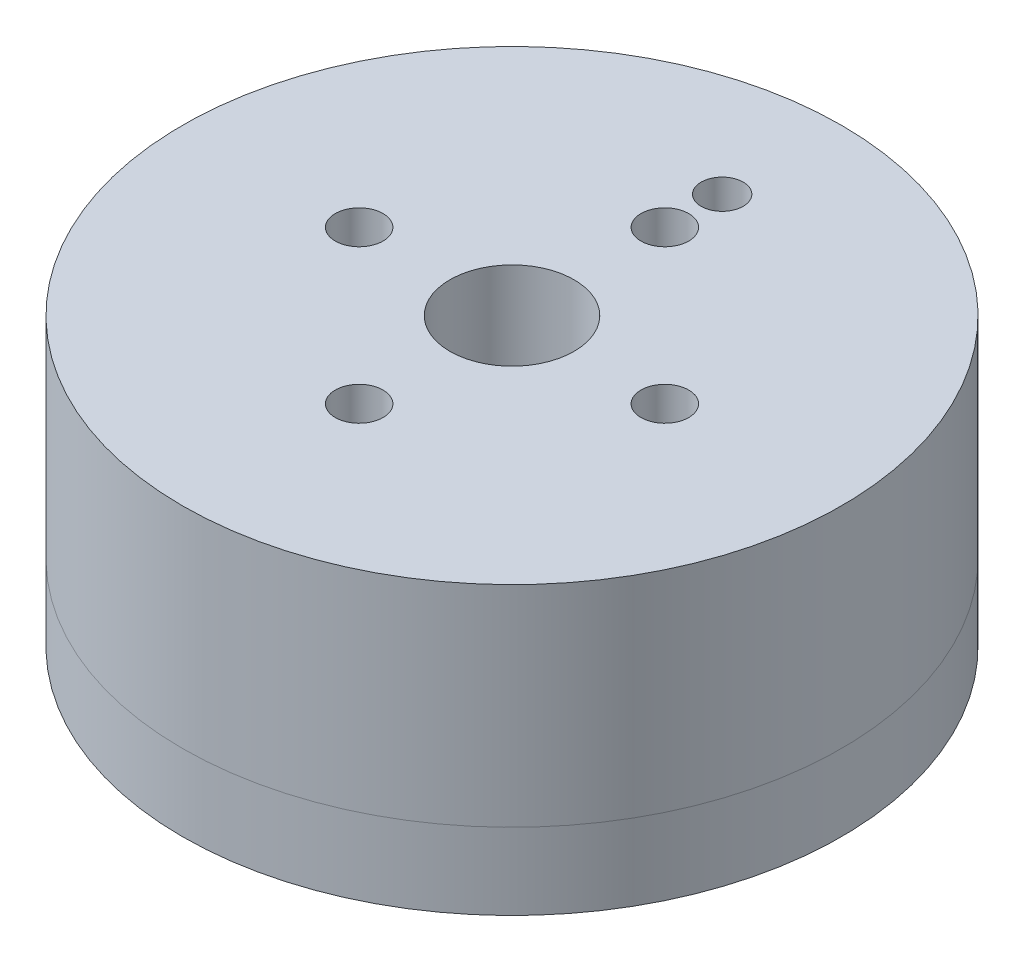
ISO-10303-21;
HEADER;
FILE_DESCRIPTION(('STEP AP214'),'2;1');
FILE_NAME('part.step','',(''),(''),'','','');
FILE_SCHEMA(('AUTOMOTIVE_DESIGN { 1 0 10303 214 1 1 1 1 }'));
ENDSEC;
DATA;
#1=APPLICATION_CONTEXT('core data for automotive mechanical design processes');
#2=APPLICATION_PROTOCOL_DEFINITION('international standard','automotive_design',2000,#1);
#3=PRODUCT_CONTEXT('',#1,'mechanical');
#4=PRODUCT('Part','Part','',(#3));
#5=PRODUCT_RELATED_PRODUCT_CATEGORY('part','',(#4));
#6=PRODUCT_DEFINITION_FORMATION('','',#4);
#7=PRODUCT_DEFINITION_CONTEXT('part definition',#1,'design');
#8=PRODUCT_DEFINITION('design','',#6,#7);
#9=PRODUCT_DEFINITION_SHAPE('','',#8);
#10=(LENGTH_UNIT() NAMED_UNIT(*) SI_UNIT(.MILLI.,.METRE.));
#11=(NAMED_UNIT(*) PLANE_ANGLE_UNIT() SI_UNIT($,.RADIAN.));
#12=(NAMED_UNIT(*) SI_UNIT($,.STERADIAN.) SOLID_ANGLE_UNIT());
#13=UNCERTAINTY_MEASURE_WITH_UNIT(LENGTH_MEASURE(1.E-05),#10,'distance_accuracy_value','');
#14=(GEOMETRIC_REPRESENTATION_CONTEXT(3) GLOBAL_UNCERTAINTY_ASSIGNED_CONTEXT((#13)) GLOBAL_UNIT_ASSIGNED_CONTEXT((#10,
#11,#12)) REPRESENTATION_CONTEXT('',''));
#15=CARTESIAN_POINT('',(0.,0.,0.));
#16=DIRECTION('',(0.,0.,1.));
#17=DIRECTION('',(1.,0.,0.));
#18=AXIS2_PLACEMENT_3D('',#15,#16,#17);
#19=CARTESIAN_POINT('',(0.,-8.5,0.));
#20=DIRECTION('',(0.,1.,0.));
#21=DIRECTION('',(0.,0.,1.));
#22=AXIS2_PLACEMENT_3D('',#19,#20,#21);
#23=CYLINDRICAL_SURFACE('',#22,5.);
#24=CARTESIAN_POINT('',(0.,-4.26794919243103,-5.));
#25=CARTESIAN_POINT('',(0.654498465135642,-4.26794919243103,-5.));
#26=CARTESIAN_POINT('',(1.30873942582763,-4.26794919243103,-4.86986338167179));
#27=CARTESIAN_POINT('',(2.51809489782327,-4.26794919243103,-4.36893194344108));
#28=CARTESIAN_POINT('',(3.07273360295979,-4.26794919243103,-3.99833420890569));
#29=CARTESIAN_POINT('',(3.99833420890569,-4.26794919243103,-3.07273360295979));
#30=CARTESIAN_POINT('',(4.36893194344106,-4.26794919243103,-2.5180948978233));
#31=CARTESIAN_POINT('',(4.8698633816718,-4.26794919243103,-1.30873942582759));
#32=CARTESIAN_POINT('',(5.,-4.26794919243103,-0.654498465134551));
#33=CARTESIAN_POINT('',(5.,-4.26794919243103,0.65449846513455));
#34=CARTESIAN_POINT('',(4.86986338167174,-4.26794919243103,1.30873942582773));
#35=CARTESIAN_POINT('',(4.36893194344112,-4.26794919243103,2.51809489782317));
#36=CARTESIAN_POINT('',(3.99833420890554,-4.26794919243102,3.07273360295993));
#37=CARTESIAN_POINT('',(3.07273360295993,-4.26794919243102,3.99833420890555));
#38=CARTESIAN_POINT('',(2.51809489782321,-4.26794919243103,4.3689319434411));
#39=CARTESIAN_POINT('',(1.3087394258277,-4.26794919243103,4.86986338167176));
#40=CARTESIAN_POINT('',(0.654498465134551,-4.26794919243103,5.));
#41=CARTESIAN_POINT('',(-0.65449846513455,-4.26794919243103,5.));
#42=CARTESIAN_POINT('',(-1.30873942582759,-4.26794919243103,4.86986338167181));
#43=CARTESIAN_POINT('',(-2.5180948978233,-4.26794919243103,4.36893194344107));
#44=CARTESIAN_POINT('',(-3.07273360295993,-4.26794919243102,3.99833420890554));
#45=CARTESIAN_POINT('',(-3.99833420890555,-4.26794919243102,3.07273360295993));
#46=CARTESIAN_POINT('',(-4.36893194344107,-4.26794919243103,2.51809489782328));
#47=CARTESIAN_POINT('',(-4.86986338167179,-4.26794919243103,1.30873942582763));
#48=CARTESIAN_POINT('',(-5.,-4.26794919243103,0.654498465134543));
#49=CARTESIAN_POINT('',(-5.,-4.26794919243103,-0.654498465134559));
#50=CARTESIAN_POINT('',(-4.86986338167173,-4.26794919243103,-1.30873942582776));
#51=CARTESIAN_POINT('',(-4.36893194344114,-4.26794919243103,-2.51809489782312));
#52=CARTESIAN_POINT('',(-3.99833420890559,-4.26794919243102,-3.07273360295988));
#53=CARTESIAN_POINT('',(-3.07273360295991,-4.26794919243102,-3.99833420890557));
#54=CARTESIAN_POINT('',(-2.51809489782318,-4.26794919243103,-4.36893194344111));
#55=CARTESIAN_POINT('',(-1.30873942582773,-4.26794919243103,-4.86986338167175));
#56=CARTESIAN_POINT('',(-0.654498465135643,-4.26794919243103,-5.));
#57=CARTESIAN_POINT('',(0.,-4.26794919243103,-5.));
#58=(BOUNDED_CURVE() B_SPLINE_CURVE(3,(#24,#25,#26,#27,#28,#29,#30,#31,#32,#33,#34,#35,#36,#37,
#38,#39,#40,#41,#42,#43,#44,#45,#46,#47,#48,#49,#50,#51,#52,#53,#54,#55,#56,#57),.UNSPECIFIED.,
.T.,.F.) B_SPLINE_CURVE_WITH_KNOTS((4,2,2,2,2,2,2,2,2,2,2,2,2,2,2,2,4),(0.,0.392699081698724,
0.785398163397448,1.17809724509617,1.5707963267949,1.96349540849362,2.35619449019234,
2.74889357189107,3.14159265358979,3.53429173528852,3.92699081698724,4.31968989868597,
4.71238898038469,5.10508806208341,5.49778714378214,5.89048622548086,6.28318530717959),
.UNSPECIFIED.) CURVE() GEOMETRIC_REPRESENTATION_ITEM() RATIONAL_B_SPLINE_CURVE((1.,1.,1.,1.,1.,
1.,1.,1.,1.,1.,1.,1.,1.,1.,1.,1.,1.,1.,1.,1.,1.,1.,1.,1.,1.,1.,1.,1.,1.,1.,1.,1.,1.,1.)) REPRESENTATION_ITEM(''));
#59=CARTESIAN_POINT('',(0.,-4.26794919243103,-5.));
#60=VERTEX_POINT('',#59);
#61=EDGE_CURVE('E13',#60,#60,#58,.F.);
#62=ORIENTED_EDGE('',*,*,#61,.T.);
#63=EDGE_LOOP('',(#62));
#64=FACE_BOUND('',#63,.T.);
#65=CARTESIAN_POINT('',(0.,-4.,0.));
#66=DIRECTION('',(0.,1.,0.));
#67=DIRECTION('',(0.,0.,1.));
#68=AXIS2_PLACEMENT_3D('',#65,#66,#67);
#69=CIRCLE('',#68,5.);
#70=CARTESIAN_POINT('',(0.,-4.,5.));
#71=VERTEX_POINT('',#70);
#72=EDGE_CURVE('E74',#71,#71,#69,.F.);
#73=ORIENTED_EDGE('',*,*,#72,.T.);
#74=EDGE_LOOP('',(#73));
#75=FACE_BOUND('',#74,.T.);
#76=ADVANCED_FACE('F60',(#64,#75),#23,.T.);
#77=CARTESIAN_POINT('',(0.,-4.,0.));
#78=DIRECTION('',(0.,1.,0.));
#79=DIRECTION('',(0.,0.,1.));
#80=AXIS2_PLACEMENT_3D('',#77,#78,#79);
#81=CYLINDRICAL_SURFACE('',#80,17.25);
#82=CARTESIAN_POINT('',(0.,-4.,0.));
#83=DIRECTION('',(0.,1.,0.));
#84=DIRECTION('',(0.,0.,1.));
#85=AXIS2_PLACEMENT_3D('',#82,#83,#84);
#86=CIRCLE('',#85,17.25);
#87=CARTESIAN_POINT('',(0.,-4.,17.25));
#88=VERTEX_POINT('',#87);
#89=EDGE_CURVE('E79',#88,#88,#86,.T.);
#90=ORIENTED_EDGE('',*,*,#89,.T.);
#91=EDGE_LOOP('',(#90));
#92=FACE_BOUND('',#91,.T.);
#93=CARTESIAN_POINT('',(0.,0.,0.));
#94=DIRECTION('',(0.,1.,0.));
#95=DIRECTION('',(0.,0.,1.));
#96=AXIS2_PLACEMENT_3D('',#93,#94,#95);
#97=CIRCLE('',#96,17.25);
#98=CARTESIAN_POINT('',(0.,0.,17.25));
#99=VERTEX_POINT('',#98);
#100=EDGE_CURVE('E84',#99,#99,#97,.T.);
#101=ORIENTED_EDGE('',*,*,#100,.F.);
#102=EDGE_LOOP('',(#101));
#103=FACE_BOUND('',#102,.T.);
#104=ADVANCED_FACE('F108',(#92,#103),#81,.T.);
#105=CARTESIAN_POINT('',(0.,-4.,0.));
#106=DIRECTION('',(0.,1.,0.));
#107=DIRECTION('',(0.,0.,1.));
#108=AXIS2_PLACEMENT_3D('',#105,#106,#107);
#109=PLANE('',#108);
#110=ORIENTED_EDGE('',*,*,#72,.F.);
#111=EDGE_LOOP('',(#110));
#112=FACE_BOUND('',#111,.T.);
#113=CARTESIAN_POINT('',(-6.69999999999986,-4.,-6.7));
#114=DIRECTION('',(0.,-1.,0.));
#115=DIRECTION('',(0.,0.,-1.));
#116=AXIS2_PLACEMENT_3D('',#113,#114,#115);
#117=CIRCLE('',#116,1.25);
#118=CARTESIAN_POINT('',(-6.69999999999986,-4.,-7.95));
#119=VERTEX_POINT('',#118);
#120=EDGE_CURVE('E160',#119,#119,#117,.T.);
#121=ORIENTED_EDGE('',*,*,#120,.F.);
#122=EDGE_LOOP('',(#121));
#123=FACE_BOUND('',#122,.T.);
#124=CARTESIAN_POINT('',(6.70000000000014,-4.,-6.7));
#125=DIRECTION('',(0.,-1.,0.));
#126=DIRECTION('',(0.,0.,-1.));
#127=AXIS2_PLACEMENT_3D('',#124,#125,#126);
#128=CIRCLE('',#127,1.25);
#129=CARTESIAN_POINT('',(6.70000000000014,-4.,-7.95));
#130=VERTEX_POINT('',#129);
#131=EDGE_CURVE('E167',#130,#130,#128,.T.);
#132=ORIENTED_EDGE('',*,*,#131,.F.);
#133=EDGE_LOOP('',(#132));
#134=FACE_BOUND('',#133,.T.);
#135=CARTESIAN_POINT('',(6.7,-4.,6.7));
#136=DIRECTION('',(0.,-1.,0.));
#137=DIRECTION('',(0.,0.,-1.));
#138=AXIS2_PLACEMENT_3D('',#135,#136,#137);
#139=CIRCLE('',#138,1.25);
#140=CARTESIAN_POINT('',(6.7,-4.,5.45));
#141=VERTEX_POINT('',#140);
#142=EDGE_CURVE('E173',#141,#141,#139,.T.);
#143=ORIENTED_EDGE('',*,*,#142,.F.);
#144=EDGE_LOOP('',(#143));
#145=FACE_BOUND('',#144,.T.);
#146=CARTESIAN_POINT('',(13.1673915721447,-4.,0.));
#147=DIRECTION('',(0.,-1.,0.));
#148=DIRECTION('',(0.,0.,-1.));
#149=AXIS2_PLACEMENT_3D('',#146,#147,#148);
#150=CIRCLE('',#149,1.1);
#151=CARTESIAN_POINT('',(13.1673915721447,-4.,-1.1));
#152=VERTEX_POINT('',#151);
#153=EDGE_CURVE('E154',#152,#152,#150,.T.);
#154=ORIENTED_EDGE('',*,*,#153,.F.);
#155=EDGE_LOOP('',(#154));
#156=FACE_BOUND('',#155,.T.);
#157=CARTESIAN_POINT('',(-6.7,-4.,6.7));
#158=DIRECTION('',(0.,-1.,0.));
#159=DIRECTION('',(0.,0.,-1.));
#160=AXIS2_PLACEMENT_3D('',#157,#158,#159);
#161=CIRCLE('',#160,1.25);
#162=CARTESIAN_POINT('',(-6.7,-4.,5.45));
#163=VERTEX_POINT('',#162);
#164=EDGE_CURVE('E149',#163,#163,#161,.T.);
#165=ORIENTED_EDGE('',*,*,#164,.F.);
#166=EDGE_LOOP('',(#165));
#167=FACE_BOUND('',#166,.T.);
#168=ORIENTED_EDGE('',*,*,#89,.F.);
#169=EDGE_LOOP('',(#168));
#170=FACE_BOUND('',#169,.T.);
#171=ADVANCED_FACE('F132',(#112,#123,#134,#145,#156,#167,#170),#109,.F.);
#172=CARTESIAN_POINT('',(0.,0.,0.));
#173=DIRECTION('',(0.,1.,0.));
#174=DIRECTION('',(0.,0.,1.));
#175=AXIS2_PLACEMENT_3D('',#172,#173,#174);
#176=PLANE('',#175);
#177=CARTESIAN_POINT('',(0.,0.,0.));
#178=DIRECTION('',(0.,1.,0.));
#179=DIRECTION('',(0.,0.,1.));
#180=AXIS2_PLACEMENT_3D('',#177,#178,#179);
#181=CIRCLE('',#180,3.25);
#182=CARTESIAN_POINT('',(0.,0.,3.25));
#183=VERTEX_POINT('',#182);
#184=EDGE_CURVE('E88',#183,#183,#181,.F.);
#185=ORIENTED_EDGE('',*,*,#184,.T.);
#186=EDGE_LOOP('',(#185));
#187=FACE_BOUND('',#186,.T.);
#188=CARTESIAN_POINT('',(-6.69999999999986,0.,-6.7));
#189=DIRECTION('',(0.,-1.,0.));
#190=DIRECTION('',(0.,0.,-1.));
#191=AXIS2_PLACEMENT_3D('',#188,#189,#190);
#192=CIRCLE('',#191,1.25);
#193=CARTESIAN_POINT('',(-6.69999999999986,0.,-7.95));
#194=VERTEX_POINT('',#193);
#195=EDGE_CURVE('E157',#194,#194,#192,.T.);
#196=ORIENTED_EDGE('',*,*,#195,.T.);
#197=EDGE_LOOP('',(#196));
#198=FACE_BOUND('',#197,.T.);
#199=CARTESIAN_POINT('',(6.70000000000014,0.,-6.7));
#200=DIRECTION('',(0.,-1.,0.));
#201=DIRECTION('',(0.,0.,-1.));
#202=AXIS2_PLACEMENT_3D('',#199,#200,#201);
#203=CIRCLE('',#202,1.25);
#204=CARTESIAN_POINT('',(6.70000000000014,0.,-7.95));
#205=VERTEX_POINT('',#204);
#206=EDGE_CURVE('E164',#205,#205,#203,.T.);
#207=ORIENTED_EDGE('',*,*,#206,.T.);
#208=EDGE_LOOP('',(#207));
#209=FACE_BOUND('',#208,.T.);
#210=CARTESIAN_POINT('',(6.7,0.,6.7));
#211=DIRECTION('',(0.,-1.,0.));
#212=DIRECTION('',(0.,0.,-1.));
#213=AXIS2_PLACEMENT_3D('',#210,#211,#212);
#214=CIRCLE('',#213,1.25);
#215=CARTESIAN_POINT('',(6.7,0.,5.45));
#216=VERTEX_POINT('',#215);
#217=EDGE_CURVE('E170',#216,#216,#214,.T.);
#218=ORIENTED_EDGE('',*,*,#217,.T.);
#219=EDGE_LOOP('',(#218));
#220=FACE_BOUND('',#219,.T.);
#221=CARTESIAN_POINT('',(13.1673915721447,0.,0.));
#222=DIRECTION('',(0.,-1.,0.));
#223=DIRECTION('',(0.,0.,-1.));
#224=AXIS2_PLACEMENT_3D('',#221,#222,#223);
#225=CIRCLE('',#224,1.1);
#226=CARTESIAN_POINT('',(13.1673915721447,0.,-1.1));
#227=VERTEX_POINT('',#226);
#228=EDGE_CURVE('E176',#227,#227,#225,.T.);
#229=ORIENTED_EDGE('',*,*,#228,.T.);
#230=EDGE_LOOP('',(#229));
#231=FACE_BOUND('',#230,.T.);
#232=CARTESIAN_POINT('',(-6.7,0.,6.7));
#233=DIRECTION('',(0.,-1.,0.));
#234=DIRECTION('',(0.,0.,-1.));
#235=AXIS2_PLACEMENT_3D('',#232,#233,#234);
#236=CIRCLE('',#235,1.25);
#237=CARTESIAN_POINT('',(-6.7,0.,5.45));
#238=VERTEX_POINT('',#237);
#239=EDGE_CURVE('E147',#238,#238,#236,.T.);
#240=ORIENTED_EDGE('',*,*,#239,.T.);
#241=EDGE_LOOP('',(#240));
#242=FACE_BOUND('',#241,.T.);
#243=ORIENTED_EDGE('',*,*,#100,.T.);
#244=EDGE_LOOP('',(#243));
#245=FACE_BOUND('',#244,.T.);
#246=ADVANCED_FACE('F130',(#187,#198,#209,#220,#231,#242,#245),#176,.T.);
#247=CARTESIAN_POINT('',(-6.7,0.,6.7));
#248=DIRECTION('',(0.,-1.,0.));
#249=DIRECTION('',(0.,0.,-1.));
#250=AXIS2_PLACEMENT_3D('',#247,#248,#249);
#251=CYLINDRICAL_SURFACE('',#250,1.25);
#252=ORIENTED_EDGE('',*,*,#239,.F.);
#253=EDGE_LOOP('',(#252));
#254=FACE_BOUND('',#253,.T.);
#255=ORIENTED_EDGE('',*,*,#164,.T.);
#256=EDGE_LOOP('',(#255));
#257=FACE_BOUND('',#256,.T.);
#258=ADVANCED_FACE('F114',(#254,#257),#251,.F.);
#259=CARTESIAN_POINT('',(13.1673915721447,0.,0.));
#260=DIRECTION('',(0.,-1.,0.));
#261=DIRECTION('',(0.,0.,-1.));
#262=AXIS2_PLACEMENT_3D('',#259,#260,#261);
#263=CYLINDRICAL_SURFACE('',#262,1.1);
#264=ORIENTED_EDGE('',*,*,#228,.F.);
#265=EDGE_LOOP('',(#264));
#266=FACE_BOUND('',#265,.T.);
#267=ORIENTED_EDGE('',*,*,#153,.T.);
#268=EDGE_LOOP('',(#267));
#269=FACE_BOUND('',#268,.T.);
#270=ADVANCED_FACE('F110',(#266,#269),#263,.F.);
#271=CARTESIAN_POINT('',(6.7,0.,6.7));
#272=DIRECTION('',(0.,-1.,0.));
#273=DIRECTION('',(0.,0.,-1.));
#274=AXIS2_PLACEMENT_3D('',#271,#272,#273);
#275=CYLINDRICAL_SURFACE('',#274,1.25);
#276=ORIENTED_EDGE('',*,*,#217,.F.);
#277=EDGE_LOOP('',(#276));
#278=FACE_BOUND('',#277,.T.);
#279=ORIENTED_EDGE('',*,*,#142,.T.);
#280=EDGE_LOOP('',(#279));
#281=FACE_BOUND('',#280,.T.);
#282=ADVANCED_FACE('F113',(#278,#281),#275,.F.);
#283=CARTESIAN_POINT('',(6.70000000000014,0.,-6.7));
#284=DIRECTION('',(0.,-1.,0.));
#285=DIRECTION('',(0.,0.,-1.));
#286=AXIS2_PLACEMENT_3D('',#283,#284,#285);
#287=CYLINDRICAL_SURFACE('',#286,1.25);
#288=ORIENTED_EDGE('',*,*,#206,.F.);
#289=EDGE_LOOP('',(#288));
#290=FACE_BOUND('',#289,.T.);
#291=ORIENTED_EDGE('',*,*,#131,.T.);
#292=EDGE_LOOP('',(#291));
#293=FACE_BOUND('',#292,.T.);
#294=ADVANCED_FACE('F118',(#290,#293),#287,.F.);
#295=CARTESIAN_POINT('',(-6.69999999999986,0.,-6.7));
#296=DIRECTION('',(0.,-1.,0.));
#297=DIRECTION('',(0.,0.,-1.));
#298=AXIS2_PLACEMENT_3D('',#295,#296,#297);
#299=CYLINDRICAL_SURFACE('',#298,1.25);
#300=ORIENTED_EDGE('',*,*,#195,.F.);
#301=EDGE_LOOP('',(#300));
#302=FACE_BOUND('',#301,.T.);
#303=ORIENTED_EDGE('',*,*,#120,.T.);
#304=EDGE_LOOP('',(#303));
#305=FACE_BOUND('',#304,.T.);
#306=ADVANCED_FACE('F122',(#302,#305),#299,.F.);
#307=CARTESIAN_POINT('',(0.,-6.,0.));
#308=DIRECTION('',(0.,-1.,0.));
#309=DIRECTION('',(0.,0.,-1.));
#310=AXIS2_PLACEMENT_3D('',#307,#308,#309);
#311=CYLINDRICAL_SURFACE('',#310,6.);
#312=CARTESIAN_POINT('',(0.,-5.99999999999993,-6.00000000000004));
#313=CARTESIAN_POINT('',(-0.785398158162777,-5.99999999999993,-6.00000000000004));
#314=CARTESIAN_POINT('',(-1.57048731099325,-5.99999999999993,-5.84383605800618));
#315=CARTESIAN_POINT('',(-3.02171387738787,-5.99999999999993,-5.24271833212934));
#316=CARTESIAN_POINT('',(-3.687280323552,-5.99999999999993,-4.79800105068692));
#317=CARTESIAN_POINT('',(-4.79800105068666,-5.99999999999993,-3.68728032355169));
#318=CARTESIAN_POINT('',(-5.24271833212935,-5.99999999999993,-3.02171387738757));
#319=CARTESIAN_POINT('',(-5.84383605800618,-5.99999999999993,-1.57048731099352));
#320=CARTESIAN_POINT('',(-6.00000000000004,-5.99999999999993,-0.785398158161477));
#321=CARTESIAN_POINT('',(-6.00000000000004,-5.99999999999993,0.785398158161458));
#322=CARTESIAN_POINT('',(-5.84383605800618,-5.99999999999993,1.57048731099311));
#323=CARTESIAN_POINT('',(-5.24271833212934,-5.99999999999993,3.02171387738801));
#324=CARTESIAN_POINT('',(-4.79800105068674,-5.99999999999993,3.68728032355189));
#325=CARTESIAN_POINT('',(-3.68728032355189,-5.99999999999993,4.79800105068674));
#326=CARTESIAN_POINT('',(-3.02171387738805,-5.99999999999993,5.24271833212953));
#327=CARTESIAN_POINT('',(-1.57048731099305,-5.99999999999993,5.843836058006));
#328=CARTESIAN_POINT('',(-0.785398158161465,-5.99999999999993,6.00000000000004));
#329=CARTESIAN_POINT('',(0.785398158161467,-5.99999999999993,6.00000000000004));
#330=CARTESIAN_POINT('',(1.5704873109932,-5.99999999999993,5.84383605800627));
#331=CARTESIAN_POINT('',(3.02171387738792,-5.99999999999993,5.24271833212924));
#332=CARTESIAN_POINT('',(3.68728032355217,-5.99999999999993,4.79800105068674));
#333=CARTESIAN_POINT('',(4.79800105068645,-5.99999999999993,3.68728032355189));
#334=CARTESIAN_POINT('',(5.24271833212953,-5.99999999999993,3.02171387738778));
#335=CARTESIAN_POINT('',(5.84383605800599,-5.99999999999993,1.57048731099334));
#336=CARTESIAN_POINT('',(6.00000000000004,-5.99999999999993,0.785398158161466));
#337=CARTESIAN_POINT('',(6.00000000000004,-5.99999999999993,-0.785398158161466));
#338=CARTESIAN_POINT('',(5.84383605800628,-5.99999999999964,-1.57048731099305));
#339=CARTESIAN_POINT('',(5.24271833212924,-6.00000000000021,-3.02171387738805));
#340=CARTESIAN_POINT('',(4.79800105068703,-5.99999999999993,-3.68728032355189));
#341=CARTESIAN_POINT('',(3.6872803235516,-5.99999999999993,-4.79800105068674));
#342=CARTESIAN_POINT('',(3.02171387738791,-5.99999999999993,-5.24271833212924));
#343=CARTESIAN_POINT('',(1.5704873109932,-5.99999999999993,-5.84383605800628));
#344=CARTESIAN_POINT('',(0.785398158162776,-5.99999999999993,-6.00000000000004));
#345=CARTESIAN_POINT('',(0.,-5.99999999999993,-6.00000000000004));
#346=(BOUNDED_CURVE() B_SPLINE_CURVE(3,(#312,#313,#314,#315,#316,#317,#318,#319,#320,#321,#322,
#323,#324,#325,#326,#327,#328,#329,#330,#331,#332,#333,#334,#335,#336,#337,#338,#339,#340,#341,
#342,#343,#344,#345),.UNSPECIFIED.,.T.,.F.) B_SPLINE_CURVE_WITH_KNOTS((4,2,2,2,2,2,2,2,2,2,2,2,
2,2,2,2,4),(0.,0.392699081698725,0.785398163397448,1.17809724509617,1.5707963267949,
1.96349540849362,2.35619449019234,2.74889357189107,3.14159265358979,3.53429173528852,
3.92699081698724,4.31968989868597,4.71238898038469,5.10508806208341,5.49778714378214,
5.89048622548086,6.28318530717959),
.UNSPECIFIED.) CURVE() GEOMETRIC_REPRESENTATION_ITEM() RATIONAL_B_SPLINE_CURVE((1.,1.,1.,1.,1.,
1.,1.,1.,1.,1.,1.,1.,1.,1.,1.,1.,1.,1.,1.,1.,1.,1.,1.,1.,1.,1.,1.,1.,1.,1.,1.,1.,1.,1.)) REPRESENTATION_ITEM(''));
#347=CARTESIAN_POINT('',(0.,-5.99999999999993,-6.00000000000004));
#348=VERTEX_POINT('',#347);
#349=EDGE_CURVE('E161',#348,#348,#346,.F.);
#350=ORIENTED_EDGE('',*,*,#349,.T.);
#351=EDGE_LOOP('',(#350));
#352=FACE_BOUND('',#351,.T.);
#353=CARTESIAN_POINT('',(0.,-8.5,0.));
#354=DIRECTION('',(0.,-1.,0.));
#355=DIRECTION('',(0.,0.,-1.));
#356=AXIS2_PLACEMENT_3D('',#353,#354,#355);
#357=CIRCLE('',#356,6.);
#358=CARTESIAN_POINT('',(0.,-8.5,-6.));
#359=VERTEX_POINT('',#358);
#360=EDGE_CURVE('E181',#359,#359,#357,.T.);
#361=ORIENTED_EDGE('',*,*,#360,.F.);
#362=EDGE_LOOP('',(#361));
#363=FACE_BOUND('',#362,.T.);
#364=ADVANCED_FACE('F126',(#352,#363),#311,.T.);
#365=CARTESIAN_POINT('',(0.,-8.5,0.));
#366=DIRECTION('',(0.,-1.,0.));
#367=DIRECTION('',(0.,0.,-1.));
#368=AXIS2_PLACEMENT_3D('',#365,#366,#367);
#369=PLANE('',#368);
#370=CARTESIAN_POINT('',(0.,-8.5,0.));
#371=DIRECTION('',(0.,-1.,0.));
#372=DIRECTION('',(0.,0.,-1.));
#373=AXIS2_PLACEMENT_3D('',#370,#371,#372);
#374=CIRCLE('',#373,2.7);
#375=CARTESIAN_POINT('',(0.,-8.5,-2.7));
#376=VERTEX_POINT('',#375);
#377=EDGE_CURVE('E184',#376,#376,#374,.T.);
#378=ORIENTED_EDGE('',*,*,#377,.F.);
#379=EDGE_LOOP('',(#378));
#380=FACE_BOUND('',#379,.T.);
#381=ORIENTED_EDGE('',*,*,#360,.T.);
#382=EDGE_LOOP('',(#381));
#383=FACE_BOUND('',#382,.T.);
#384=ADVANCED_FACE('F109',(#380,#383),#369,.T.);
#385=CARTESIAN_POINT('',(0.,1.63675323681471,0.));
#386=DIRECTION('',(0.,-1.,0.));
#387=DIRECTION('',(0.,0.,-1.));
#388=AXIS2_PLACEMENT_3D('',#385,#386,#387);
#389=CYLINDRICAL_SURFACE('',#388,2.7);
#390=CARTESIAN_POINT('',(0.,-6.,0.));
#391=DIRECTION('',(0.,-1.,0.));
#392=DIRECTION('',(0.,0.,-1.));
#393=AXIS2_PLACEMENT_3D('',#390,#391,#392);
#394=CIRCLE('',#393,2.7);
#395=CARTESIAN_POINT('',(0.,-6.,-2.7));
#396=VERTEX_POINT('',#395);
#397=EDGE_CURVE('E90',#396,#396,#394,.F.);
#398=ORIENTED_EDGE('',*,*,#397,.T.);
#399=EDGE_LOOP('',(#398));
#400=FACE_BOUND('',#399,.T.);
#401=ORIENTED_EDGE('',*,*,#377,.T.);
#402=EDGE_LOOP('',(#401));
#403=FACE_BOUND('',#402,.T.);
#404=ADVANCED_FACE('F204',(#400,#403),#389,.F.);
#405=CARTESIAN_POINT('',(0.,-6.,0.));
#406=DIRECTION('',(0.,-1.,0.));
#407=DIRECTION('',(0.,0.,-1.));
#408=AXIS2_PLACEMENT_3D('',#405,#406,#407);
#409=PLANE('',#408);
#410=CARTESIAN_POINT('',(0.,-6.,0.));
#411=DIRECTION('',(0.,-1.,0.));
#412=DIRECTION('',(0.,0.,-1.));
#413=AXIS2_PLACEMENT_3D('',#410,#411,#412);
#414=CIRCLE('',#413,3.25);
#415=CARTESIAN_POINT('',(0.,-6.,-3.25));
#416=VERTEX_POINT('',#415);
#417=EDGE_CURVE('E91',#416,#416,#414,.F.);
#418=ORIENTED_EDGE('',*,*,#417,.T.);
#419=EDGE_LOOP('',(#418));
#420=FACE_BOUND('',#419,.T.);
#421=ORIENTED_EDGE('',*,*,#397,.F.);
#422=EDGE_LOOP('',(#421));
#423=FACE_BOUND('',#422,.T.);
#424=ADVANCED_FACE('F192',(#420,#423),#409,.F.);
#425=CARTESIAN_POINT('',(0.,20.1923881554251,0.));
#426=DIRECTION('',(0.,-1.,0.));
#427=DIRECTION('',(0.,0.,-1.));
#428=AXIS2_PLACEMENT_3D('',#425,#426,#427);
#429=CYLINDRICAL_SURFACE('',#428,3.25);
#430=ORIENTED_EDGE('',*,*,#184,.F.);
#431=EDGE_LOOP('',(#430));
#432=FACE_BOUND('',#431,.T.);
#433=ORIENTED_EDGE('',*,*,#417,.F.);
#434=EDGE_LOOP('',(#433));
#435=FACE_BOUND('',#434,.T.);
#436=ADVANCED_FACE('F195',(#432,#435),#429,.F.);
#437=CARTESIAN_POINT('',(0.,-5.99999999999993,-6.00000000000004));
#438=CARTESIAN_POINT('',(0.785398158162776,-5.99999999999993,-6.00000000000004));
#439=CARTESIAN_POINT('',(1.5704873109932,-5.99999999999993,-5.84383605800628));
#440=CARTESIAN_POINT('',(3.02171387738791,-5.99999999999993,-5.24271833212924));
#441=CARTESIAN_POINT('',(3.6872803235516,-5.99999999999993,-4.79800105068674));
#442=CARTESIAN_POINT('',(4.79800105068703,-5.99999999999993,-3.68728032355189));
#443=CARTESIAN_POINT('',(5.24271833212924,-6.00000000000021,-3.02171387738805));
#444=CARTESIAN_POINT('',(5.84383605800628,-5.99999999999964,-1.57048731099305));
#445=CARTESIAN_POINT('',(6.00000000000004,-5.99999999999993,-0.785398158161466));
#446=CARTESIAN_POINT('',(6.00000000000004,-5.99999999999993,0.785398158161466));
#447=CARTESIAN_POINT('',(5.84383605800599,-5.99999999999993,1.57048731099334));
#448=CARTESIAN_POINT('',(5.24271833212953,-5.99999999999993,3.02171387738778));
#449=CARTESIAN_POINT('',(4.79800105068645,-5.99999999999993,3.68728032355189));
#450=CARTESIAN_POINT('',(3.68728032355217,-5.99999999999993,4.79800105068674));
#451=CARTESIAN_POINT('',(3.02171387738792,-5.99999999999993,5.24271833212924));
#452=CARTESIAN_POINT('',(1.5704873109932,-5.99999999999993,5.84383605800627));
#453=CARTESIAN_POINT('',(0.785398158161467,-5.99999999999993,6.00000000000004));
#454=CARTESIAN_POINT('',(-0.785398158161465,-5.99999999999993,6.00000000000004));
#455=CARTESIAN_POINT('',(-1.57048731099305,-5.99999999999993,5.843836058006));
#456=CARTESIAN_POINT('',(-3.02171387738805,-5.99999999999993,5.24271833212953));
#457=CARTESIAN_POINT('',(-3.68728032355189,-5.99999999999993,4.79800105068674));
#458=CARTESIAN_POINT('',(-4.79800105068674,-5.99999999999993,3.68728032355189));
#459=CARTESIAN_POINT('',(-5.24271833212934,-5.99999999999993,3.02171387738801));
#460=CARTESIAN_POINT('',(-5.84383605800618,-5.99999999999993,1.57048731099311));
#461=CARTESIAN_POINT('',(-6.00000000000004,-5.99999999999993,0.785398158161458));
#462=CARTESIAN_POINT('',(-6.00000000000004,-5.99999999999993,-0.785398158161477));
#463=CARTESIAN_POINT('',(-5.84383605800618,-5.99999999999993,-1.57048731099352));
#464=CARTESIAN_POINT('',(-5.24271833212935,-5.99999999999993,-3.02171387738757));
#465=CARTESIAN_POINT('',(-4.79800105068666,-5.99999999999993,-3.68728032355169));
#466=CARTESIAN_POINT('',(-3.687280323552,-5.99999999999993,-4.79800105068692));
#467=CARTESIAN_POINT('',(-3.02171387738787,-5.99999999999993,-5.24271833212934));
#468=CARTESIAN_POINT('',(-1.57048731099325,-5.99999999999993,-5.84383605800618));
#469=CARTESIAN_POINT('',(-0.785398158162777,-5.99999999999993,-6.00000000000004));
#470=CARTESIAN_POINT('',(0.,-5.99999999999993,-6.00000000000004));
#471=CARTESIAN_POINT('',(0.,-5.42264973081031,-5.));
#472=CARTESIAN_POINT('',(0.654498465135642,-5.42264973081031,-5.));
#473=CARTESIAN_POINT('',(1.3087394258277,-5.42264973081031,-4.86986338167205));
#474=CARTESIAN_POINT('',(2.5180948978232,-5.42264973081031,-4.36893194344081));
#475=CARTESIAN_POINT('',(3.07273360295936,-5.42264973081031,-3.9983342089054));
#476=CARTESIAN_POINT('',(3.99833420890611,-5.42264973081031,-3.07273360296007));
#477=CARTESIAN_POINT('',(4.3689319434411,-5.42264973081059,-2.51809489782306));
#478=CARTESIAN_POINT('',(4.86986338167177,-5.42264973081003,-1.30873942582784));
#479=CARTESIAN_POINT('',(5.,-5.42264973081031,-0.654498465134551));
#480=CARTESIAN_POINT('',(5.,-5.42264973081031,0.65449846513455));
#481=CARTESIAN_POINT('',(4.8698633816712,-5.42264973081031,1.30873942582763));
#482=CARTESIAN_POINT('',(4.36893194344166,-5.42264973081031,2.51809489782327));
#483=CARTESIAN_POINT('',(3.9983342089054,-5.42264973081031,3.07273360296007));
#484=CARTESIAN_POINT('',(3.07273360296007,-5.42264973081031,3.99833420890541));
#485=CARTESIAN_POINT('',(2.51809489782321,-5.42264973081031,4.3689319434411));
#486=CARTESIAN_POINT('',(1.3087394258277,-5.42264973081031,4.86986338167177));
#487=CARTESIAN_POINT('',(0.654498465134551,-5.42264973081031,5.));
#488=CARTESIAN_POINT('',(-0.65449846513455,-5.42264973081031,5.));
#489=CARTESIAN_POINT('',(-1.30873942582769,-5.42264973081031,4.86986338167206));
#490=CARTESIAN_POINT('',(-2.51809489782319,-5.42264973081031,4.36893194344082));
#491=CARTESIAN_POINT('',(-3.07273360296007,-5.42264973081031,3.99833420890568));
#492=CARTESIAN_POINT('',(-3.99833420890541,-5.42264973081031,3.07273360295979));
#493=CARTESIAN_POINT('',(-4.36893194344108,-5.42264973081031,2.51809489782335));
#494=CARTESIAN_POINT('',(-4.86986338167178,-5.42264973081031,1.30873942582756));
#495=CARTESIAN_POINT('',(-5.,-5.42264973081031,0.654498465134543));
#496=CARTESIAN_POINT('',(-5.,-5.42264973081031,-0.654498465134559));
#497=CARTESIAN_POINT('',(-4.86986338167207,-5.42264973081031,-1.30873942582804));
#498=CARTESIAN_POINT('',(-4.36893194344081,-5.42264973081031,-2.51809489782284));
#499=CARTESIAN_POINT('',(-3.99833420890538,-5.42264973081031,-3.07273360295981));
#500=CARTESIAN_POINT('',(-3.07273360296012,-5.42264973081031,-3.99833420890564));
#501=CARTESIAN_POINT('',(-2.51809489782336,-5.42264973081031,-4.36893194344137));
#502=CARTESIAN_POINT('',(-1.30873942582756,-5.42264973081031,-4.86986338167149));
#503=CARTESIAN_POINT('',(-0.654498465135643,-5.42264973081031,-5.));
#504=CARTESIAN_POINT('',(0.,-5.42264973081031,-5.));
#505=CARTESIAN_POINT('',(0.,-4.26794919243103,-5.));
#506=CARTESIAN_POINT('',(0.654498465135642,-4.26794919243103,-5.));
#507=CARTESIAN_POINT('',(1.30873942582763,-4.26794919243103,-4.86986338167179));
#508=CARTESIAN_POINT('',(2.51809489782327,-4.26794919243103,-4.36893194344108));
#509=CARTESIAN_POINT('',(3.07273360295979,-4.26794919243103,-3.99833420890569));
#510=CARTESIAN_POINT('',(3.99833420890569,-4.26794919243103,-3.07273360295979));
#511=CARTESIAN_POINT('',(4.36893194344106,-4.26794919243103,-2.5180948978233));
#512=CARTESIAN_POINT('',(4.8698633816718,-4.26794919243103,-1.30873942582759));
#513=CARTESIAN_POINT('',(5.,-4.26794919243103,-0.654498465134551));
#514=CARTESIAN_POINT('',(5.,-4.26794919243103,0.65449846513455));
#515=CARTESIAN_POINT('',(4.86986338167174,-4.26794919243103,1.30873942582773));
#516=CARTESIAN_POINT('',(4.36893194344112,-4.26794919243103,2.51809489782317));
#517=CARTESIAN_POINT('',(3.99833420890554,-4.26794919243102,3.07273360295993));
#518=CARTESIAN_POINT('',(3.07273360295993,-4.26794919243102,3.99833420890555));
#519=CARTESIAN_POINT('',(2.51809489782321,-4.26794919243103,4.3689319434411));
#520=CARTESIAN_POINT('',(1.3087394258277,-4.26794919243103,4.86986338167176));
#521=CARTESIAN_POINT('',(0.654498465134551,-4.26794919243103,5.));
#522=CARTESIAN_POINT('',(-0.65449846513455,-4.26794919243103,5.));
#523=CARTESIAN_POINT('',(-1.30873942582759,-4.26794919243103,4.86986338167181));
#524=CARTESIAN_POINT('',(-2.5180948978233,-4.26794919243103,4.36893194344107));
#525=CARTESIAN_POINT('',(-3.07273360295993,-4.26794919243102,3.99833420890554));
#526=CARTESIAN_POINT('',(-3.99833420890555,-4.26794919243102,3.07273360295993));
#527=CARTESIAN_POINT('',(-4.36893194344107,-4.26794919243103,2.51809489782328));
#528=CARTESIAN_POINT('',(-4.86986338167179,-4.26794919243103,1.30873942582763));
#529=CARTESIAN_POINT('',(-5.,-4.26794919243103,0.654498465134543));
#530=CARTESIAN_POINT('',(-5.,-4.26794919243103,-0.654498465134559));
#531=CARTESIAN_POINT('',(-4.86986338167173,-4.26794919243103,-1.30873942582776));
#532=CARTESIAN_POINT('',(-4.36893194344114,-4.26794919243103,-2.51809489782312));
#533=CARTESIAN_POINT('',(-3.99833420890559,-4.26794919243102,-3.07273360295988));
#534=CARTESIAN_POINT('',(-3.07273360295991,-4.26794919243102,-3.99833420890557));
#535=CARTESIAN_POINT('',(-2.51809489782318,-4.26794919243103,-4.36893194344111));
#536=CARTESIAN_POINT('',(-1.30873942582773,-4.26794919243103,-4.86986338167175));
#537=CARTESIAN_POINT('',(-0.654498465135643,-4.26794919243103,-5.));
#538=CARTESIAN_POINT('',(0.,-4.26794919243103,-5.));
#539=(BOUNDED_SURFACE() B_SPLINE_SURFACE(2,3,((#437,#438,#439,#440,#441,#442,#443,#444,#445,
#446,#447,#448,#449,#450,#451,#452,#453,#454,#455,#456,#457,#458,#459,#460,#461,#462,#463,#464,
#465,#466,#467,#468,#469,#470),(#471,#472,#473,#474,#475,#476,#477,#478,#479,#480,#481,#482,
#483,#484,#485,#486,#487,#488,#489,#490,#491,#492,#493,#494,#495,#496,#497,#498,#499,#500,#501,
#502,#503,#504),(#505,#506,#507,#508,#509,#510,#511,#512,#513,#514,#515,#516,#517,#518,#519,
#520,#521,#522,#523,#524,#525,#526,#527,#528,#529,#530,#531,#532,#533,#534,#535,#536,#537,
#538)),.UNSPECIFIED.,.F.,.T.,.F.) B_SPLINE_SURFACE_WITH_KNOTS((3,3),(4,2,2,2,2,2,2,2,2,2,2,2,2,
2,2,2,4),(0.,1.),(0.,0.392699081698724,0.785398163397448,1.17809724509617,1.5707963267949,
1.96349540849362,2.35619449019234,2.74889357189107,3.14159265358979,3.53429173528852,
3.92699081698724,4.31968989868597,4.71238898038469,5.10508806208341,5.49778714378214,
5.89048622548086,6.28318530717959),
.UNSPECIFIED.) GEOMETRIC_REPRESENTATION_ITEM() RATIONAL_B_SPLINE_SURFACE(((1.,1.,1.,1.,1.,1.,1.,
1.,1.,1.,1.,1.,1.,1.,1.,1.,1.,1.,1.,1.,1.,1.,1.,1.,1.,1.,1.,1.,1.,1.,1.,1.,1.,1.),
(0.866025403784432,0.866025403784432,0.866025403784432,0.866025403784432,0.866025403784432,
0.866025403784432,0.866025403784432,0.866025403784432,0.866025403784432,0.866025403784432,
0.866025403784432,0.866025403784432,0.866025403784432,0.866025403784432,0.866025403784432,
0.866025403784432,0.866025403784432,0.866025403784432,0.866025403784432,0.866025403784432,
0.866025403784432,0.866025403784432,0.866025403784432,0.866025403784432,0.866025403784432,
0.866025403784432,0.866025403784432,0.866025403784432,0.866025403784432,0.866025403784432,
0.866025403784432,0.866025403784432,0.866025403784432,0.866025403784432),(1.,1.,1.,1.,1.,1.,1.,
1.,1.,1.,1.,1.,1.,1.,1.,1.,1.,1.,1.,1.,1.,1.,1.,1.,1.,1.,1.,1.,1.,1.,1.,1.,1.,1.))) REPRESENTATION_ITEM('') SURFACE());
#540=ORIENTED_EDGE('',*,*,#61,.F.);
#541=EDGE_LOOP('',(#540));
#542=FACE_BOUND('',#541,.T.);
#543=ORIENTED_EDGE('',*,*,#349,.F.);
#544=EDGE_LOOP('',(#543));
#545=FACE_BOUND('',#544,.T.);
#546=ADVANCED_FACE('F63',(#542,#545),#539,.T.);
#547=CLOSED_SHELL('',(#76,#104,#171,#246,#258,#270,#282,#294,#306,#364,#384,#404,#424,#436,#546));
#548=MANIFOLD_SOLID_BREP('B2',#547);
#549=CARTESIAN_POINT('',(0.,11.,0.));
#550=DIRECTION('',(0.,-1.,0.));
#551=DIRECTION('',(0.,0.,-1.));
#552=AXIS2_PLACEMENT_3D('',#549,#550,#551);
#553=CYLINDRICAL_SURFACE('',#552,17.25);
#554=CARTESIAN_POINT('',(0.,11.,0.));
#555=DIRECTION('',(0.,1.,0.));
#556=DIRECTION('',(0.,0.,1.));
#557=AXIS2_PLACEMENT_3D('',#554,#555,#556);
#558=CIRCLE('',#557,17.25);
#559=CARTESIAN_POINT('',(0.,11.,17.25));
#560=VERTEX_POINT('',#559);
#561=EDGE_CURVE('E59',#560,#560,#558,.T.);
#562=ORIENTED_EDGE('',*,*,#561,.F.);
#563=EDGE_LOOP('',(#562));
#564=FACE_BOUND('',#563,.T.);
#565=CARTESIAN_POINT('',(0.,0.,0.));
#566=DIRECTION('',(0.,1.,0.));
#567=DIRECTION('',(0.,0.,1.));
#568=AXIS2_PLACEMENT_3D('',#565,#566,#567);
#569=CIRCLE('',#568,17.25);
#570=CARTESIAN_POINT('',(0.,0.,17.25));
#571=VERTEX_POINT('',#570);
#572=EDGE_CURVE('E422',#571,#571,#569,.T.);
#573=ORIENTED_EDGE('',*,*,#572,.T.);
#574=EDGE_LOOP('',(#573));
#575=FACE_BOUND('',#574,.T.);
#576=ADVANCED_FACE('F414',(#564,#575),#553,.T.);
#577=CARTESIAN_POINT('',(0.,11.,0.));
#578=DIRECTION('',(0.,1.,0.));
#579=DIRECTION('',(0.,0.,1.));
#580=AXIS2_PLACEMENT_3D('',#577,#578,#579);
#581=PLANE('',#580);
#582=CARTESIAN_POINT('',(0.,11.,0.));
#583=DIRECTION('',(0.,1.,0.));
#584=DIRECTION('',(0.,0.,1.));
#585=AXIS2_PLACEMENT_3D('',#582,#583,#584);
#586=CIRCLE('',#585,3.25);
#587=CARTESIAN_POINT('',(0.,11.,3.25));
#588=VERTEX_POINT('',#587);
#589=EDGE_CURVE('E469',#588,#588,#586,.T.);
#590=ORIENTED_EDGE('',*,*,#589,.F.);
#591=EDGE_LOOP('',(#590));
#592=FACE_BOUND('',#591,.T.);
#593=CARTESIAN_POINT('',(0.,11.,-11.));
#594=DIRECTION('',(0.,1.,0.));
#595=DIRECTION('',(0.,0.,1.));
#596=AXIS2_PLACEMENT_3D('',#593,#594,#595);
#597=CIRCLE('',#596,1.1);
#598=CARTESIAN_POINT('',(0.,11.,-9.9));
#599=VERTEX_POINT('',#598);
#600=EDGE_CURVE('E434',#599,#599,#597,.T.);
#601=ORIENTED_EDGE('',*,*,#600,.F.);
#602=EDGE_LOOP('',(#601));
#603=FACE_BOUND('',#602,.T.);
#604=CARTESIAN_POINT('',(8.,11.,0.));
#605=DIRECTION('',(0.,1.,0.));
#606=DIRECTION('',(0.,0.,1.));
#607=AXIS2_PLACEMENT_3D('',#604,#605,#606);
#608=CIRCLE('',#607,1.25);
#609=CARTESIAN_POINT('',(8.,11.,1.25));
#610=VERTEX_POINT('',#609);
#611=EDGE_CURVE('E442',#610,#610,#608,.T.);
#612=ORIENTED_EDGE('',*,*,#611,.F.);
#613=EDGE_LOOP('',(#612));
#614=FACE_BOUND('',#613,.T.);
#615=CARTESIAN_POINT('',(0.,11.,8.));
#616=DIRECTION('',(0.,1.,0.));
#617=DIRECTION('',(0.,0.,1.));
#618=AXIS2_PLACEMENT_3D('',#615,#616,#617);
#619=CIRCLE('',#618,1.25);
#620=CARTESIAN_POINT('',(0.,11.,9.25));
#621=VERTEX_POINT('',#620);
#622=EDGE_CURVE('E443',#621,#621,#619,.T.);
#623=ORIENTED_EDGE('',*,*,#622,.F.);
#624=EDGE_LOOP('',(#623));
#625=FACE_BOUND('',#624,.T.);
#626=CARTESIAN_POINT('',(-8.,11.,0.));
#627=DIRECTION('',(0.,1.,0.));
#628=DIRECTION('',(0.,0.,1.));
#629=AXIS2_PLACEMENT_3D('',#626,#627,#628);
#630=CIRCLE('',#629,1.25);
#631=CARTESIAN_POINT('',(-8.,11.,1.25));
#632=VERTEX_POINT('',#631);
#633=EDGE_CURVE('E458',#632,#632,#630,.T.);
#634=ORIENTED_EDGE('',*,*,#633,.F.);
#635=EDGE_LOOP('',(#634));
#636=FACE_BOUND('',#635,.T.);
#637=CARTESIAN_POINT('',(0.,11.,-8.));
#638=DIRECTION('',(0.,1.,0.));
#639=DIRECTION('',(0.,0.,1.));
#640=AXIS2_PLACEMENT_3D('',#637,#638,#639);
#641=CIRCLE('',#640,1.25);
#642=CARTESIAN_POINT('',(0.,11.,-6.75));
#643=VERTEX_POINT('',#642);
#644=EDGE_CURVE('E430',#643,#643,#641,.T.);
#645=ORIENTED_EDGE('',*,*,#644,.F.);
#646=EDGE_LOOP('',(#645));
#647=FACE_BOUND('',#646,.T.);
#648=ORIENTED_EDGE('',*,*,#561,.T.);
#649=EDGE_LOOP('',(#648));
#650=FACE_BOUND('',#649,.T.);
#651=ADVANCED_FACE('F484',(#592,#603,#614,#625,#636,#647,#650),#581,.T.);
#652=CARTESIAN_POINT('',(0.,0.,0.));
#653=DIRECTION('',(0.,1.,0.));
#654=DIRECTION('',(0.,0.,1.));
#655=AXIS2_PLACEMENT_3D('',#652,#653,#654);
#656=PLANE('',#655);
#657=CARTESIAN_POINT('',(0.,0.,0.));
#658=DIRECTION('',(0.,1.,0.));
#659=DIRECTION('',(0.,0.,1.));
#660=AXIS2_PLACEMENT_3D('',#657,#658,#659);
#661=CIRCLE('',#660,3.25);
#662=CARTESIAN_POINT('',(0.,0.,3.25));
#663=VERTEX_POINT('',#662);
#664=EDGE_CURVE('E417',#663,#663,#661,.F.);
#665=ORIENTED_EDGE('',*,*,#664,.F.);
#666=EDGE_LOOP('',(#665));
#667=FACE_BOUND('',#666,.T.);
#668=ORIENTED_EDGE('',*,*,#572,.F.);
#669=EDGE_LOOP('',(#668));
#670=FACE_BOUND('',#669,.T.);
#671=ADVANCED_FACE('F480',(#667,#670),#656,.F.);
#672=CARTESIAN_POINT('',(0.,8.,-8.));
#673=DIRECTION('',(0.,1.,0.));
#674=DIRECTION('',(0.,0.,1.));
#675=AXIS2_PLACEMENT_3D('',#672,#673,#674);
#676=CYLINDRICAL_SURFACE('',#675,1.25);
#677=CARTESIAN_POINT('',(0.,8.,-8.));
#678=DIRECTION('',(0.,1.,0.));
#679=DIRECTION('',(0.,0.,1.));
#680=AXIS2_PLACEMENT_3D('',#677,#678,#679);
#681=CIRCLE('',#680,1.25);
#682=CARTESIAN_POINT('',(0.,8.,-6.75));
#683=VERTEX_POINT('',#682);
#684=EDGE_CURVE('E428',#683,#683,#681,.T.);
#685=ORIENTED_EDGE('',*,*,#684,.F.);
#686=EDGE_LOOP('',(#685));
#687=FACE_BOUND('',#686,.T.);
#688=ORIENTED_EDGE('',*,*,#644,.T.);
#689=EDGE_LOOP('',(#688));
#690=FACE_BOUND('',#689,.T.);
#691=ADVANCED_FACE('F483',(#687,#690),#676,.F.);
#692=CARTESIAN_POINT('',(0.,8.,-8.));
#693=DIRECTION('',(0.,1.,0.));
#694=DIRECTION('',(0.,0.,1.));
#695=AXIS2_PLACEMENT_3D('',#692,#693,#694);
#696=PLANE('',#695);
#697=ORIENTED_EDGE('',*,*,#684,.T.);
#698=EDGE_LOOP('',(#697));
#699=FACE_BOUND('',#698,.T.);
#700=ADVANCED_FACE('F500',(#699),#696,.T.);
#701=CARTESIAN_POINT('',(-8.,8.,0.));
#702=DIRECTION('',(0.,1.,0.));
#703=DIRECTION('',(0.,0.,1.));
#704=AXIS2_PLACEMENT_3D('',#701,#702,#703);
#705=CYLINDRICAL_SURFACE('',#704,1.25);
#706=CARTESIAN_POINT('',(-8.,8.,0.));
#707=DIRECTION('',(0.,1.,0.));
#708=DIRECTION('',(0.,0.,1.));
#709=AXIS2_PLACEMENT_3D('',#706,#707,#708);
#710=CIRCLE('',#709,1.25);
#711=CARTESIAN_POINT('',(-8.,8.,1.25));
#712=VERTEX_POINT('',#711);
#713=EDGE_CURVE('E454',#712,#712,#710,.T.);
#714=ORIENTED_EDGE('',*,*,#713,.F.);
#715=EDGE_LOOP('',(#714));
#716=FACE_BOUND('',#715,.T.);
#717=ORIENTED_EDGE('',*,*,#633,.T.);
#718=EDGE_LOOP('',(#717));
#719=FACE_BOUND('',#718,.T.);
#720=ADVANCED_FACE('F504',(#716,#719),#705,.F.);
#721=CARTESIAN_POINT('',(-8.,8.,0.));
#722=DIRECTION('',(0.,1.,0.));
#723=DIRECTION('',(0.,0.,1.));
#724=AXIS2_PLACEMENT_3D('',#721,#722,#723);
#725=PLANE('',#724);
#726=ORIENTED_EDGE('',*,*,#713,.T.);
#727=EDGE_LOOP('',(#726));
#728=FACE_BOUND('',#727,.T.);
#729=ADVANCED_FACE('F523',(#728),#725,.T.);
#730=CARTESIAN_POINT('',(0.,8.,8.));
#731=DIRECTION('',(0.,1.,0.));
#732=DIRECTION('',(0.,0.,1.));
#733=AXIS2_PLACEMENT_3D('',#730,#731,#732);
#734=CYLINDRICAL_SURFACE('',#733,1.25);
#735=CARTESIAN_POINT('',(0.,8.,8.));
#736=DIRECTION('',(0.,1.,0.));
#737=DIRECTION('',(0.,0.,1.));
#738=AXIS2_PLACEMENT_3D('',#735,#736,#737);
#739=CIRCLE('',#738,1.25);
#740=CARTESIAN_POINT('',(0.,8.,9.25));
#741=VERTEX_POINT('',#740);
#742=EDGE_CURVE('E462',#741,#741,#739,.T.);
#743=ORIENTED_EDGE('',*,*,#742,.F.);
#744=EDGE_LOOP('',(#743));
#745=FACE_BOUND('',#744,.T.);
#746=ORIENTED_EDGE('',*,*,#622,.T.);
#747=EDGE_LOOP('',(#746));
#748=FACE_BOUND('',#747,.T.);
#749=ADVANCED_FACE('F526',(#745,#748),#734,.F.);
#750=CARTESIAN_POINT('',(0.,8.,8.));
#751=DIRECTION('',(0.,1.,0.));
#752=DIRECTION('',(0.,0.,1.));
#753=AXIS2_PLACEMENT_3D('',#750,#751,#752);
#754=PLANE('',#753);
#755=ORIENTED_EDGE('',*,*,#742,.T.);
#756=EDGE_LOOP('',(#755));
#757=FACE_BOUND('',#756,.T.);
#758=ADVANCED_FACE('F514',(#757),#754,.T.);
#759=CARTESIAN_POINT('',(8.,8.,0.));
#760=DIRECTION('',(0.,1.,0.));
#761=DIRECTION('',(0.,0.,1.));
#762=AXIS2_PLACEMENT_3D('',#759,#760,#761);
#763=CYLINDRICAL_SURFACE('',#762,1.25);
#764=CARTESIAN_POINT('',(8.,8.,0.));
#765=DIRECTION('',(0.,1.,0.));
#766=DIRECTION('',(0.,0.,1.));
#767=AXIS2_PLACEMENT_3D('',#764,#765,#766);
#768=CIRCLE('',#767,1.25);
#769=CARTESIAN_POINT('',(8.,8.,1.25));
#770=VERTEX_POINT('',#769);
#771=EDGE_CURVE('E438',#770,#770,#768,.T.);
#772=ORIENTED_EDGE('',*,*,#771,.F.);
#773=EDGE_LOOP('',(#772));
#774=FACE_BOUND('',#773,.T.);
#775=ORIENTED_EDGE('',*,*,#611,.T.);
#776=EDGE_LOOP('',(#775));
#777=FACE_BOUND('',#776,.T.);
#778=ADVANCED_FACE('F510',(#774,#777),#763,.F.);
#779=CARTESIAN_POINT('',(8.,8.,0.));
#780=DIRECTION('',(0.,1.,0.));
#781=DIRECTION('',(0.,0.,1.));
#782=AXIS2_PLACEMENT_3D('',#779,#780,#781);
#783=PLANE('',#782);
#784=ORIENTED_EDGE('',*,*,#771,.T.);
#785=EDGE_LOOP('',(#784));
#786=FACE_BOUND('',#785,.T.);
#787=ADVANCED_FACE('F506',(#786),#783,.T.);
#788=CARTESIAN_POINT('',(0.,8.,-11.));
#789=DIRECTION('',(0.,1.,0.));
#790=DIRECTION('',(0.,0.,1.));
#791=AXIS2_PLACEMENT_3D('',#788,#789,#790);
#792=CYLINDRICAL_SURFACE('',#791,1.1);
#793=CARTESIAN_POINT('',(0.,8.,-11.));
#794=DIRECTION('',(0.,1.,0.));
#795=DIRECTION('',(0.,0.,1.));
#796=AXIS2_PLACEMENT_3D('',#793,#794,#795);
#797=CIRCLE('',#796,1.1);
#798=CARTESIAN_POINT('',(0.,8.,-9.9));
#799=VERTEX_POINT('',#798);
#800=EDGE_CURVE('E447',#799,#799,#797,.T.);
#801=ORIENTED_EDGE('',*,*,#800,.F.);
#802=EDGE_LOOP('',(#801));
#803=FACE_BOUND('',#802,.T.);
#804=ORIENTED_EDGE('',*,*,#600,.T.);
#805=EDGE_LOOP('',(#804));
#806=FACE_BOUND('',#805,.T.);
#807=ADVANCED_FACE('F509',(#803,#806),#792,.F.);
#808=CARTESIAN_POINT('',(0.,8.,-11.));
#809=DIRECTION('',(0.,1.,0.));
#810=DIRECTION('',(0.,0.,1.));
#811=AXIS2_PLACEMENT_3D('',#808,#809,#810);
#812=PLANE('',#811);
#813=ORIENTED_EDGE('',*,*,#800,.T.);
#814=EDGE_LOOP('',(#813));
#815=FACE_BOUND('',#814,.T.);
#816=ADVANCED_FACE('F516',(#815),#812,.T.);
#817=CARTESIAN_POINT('',(0.,20.1923881554251,0.));
#818=DIRECTION('',(0.,-1.,0.));
#819=DIRECTION('',(0.,0.,-1.));
#820=AXIS2_PLACEMENT_3D('',#817,#818,#819);
#821=CYLINDRICAL_SURFACE('',#820,3.25);
#822=ORIENTED_EDGE('',*,*,#589,.T.);
#823=EDGE_LOOP('',(#822));
#824=FACE_BOUND('',#823,.T.);
#825=ORIENTED_EDGE('',*,*,#664,.T.);
#826=EDGE_LOOP('',(#825));
#827=FACE_BOUND('',#826,.T.);
#828=ADVANCED_FACE('F478',(#824,#827),#821,.F.);
#829=CLOSED_SHELL('',(#576,#651,#671,#691,#700,#720,#729,#749,#758,#778,#787,#807,#816,#828));
#830=MANIFOLD_SOLID_BREP('B8',#829);
#831=ADVANCED_BREP_SHAPE_REPRESENTATION('',(#18,#548,#830),#14);
#832=SHAPE_DEFINITION_REPRESENTATION(#9,#831);
ENDSEC;
END-ISO-10303-21;
